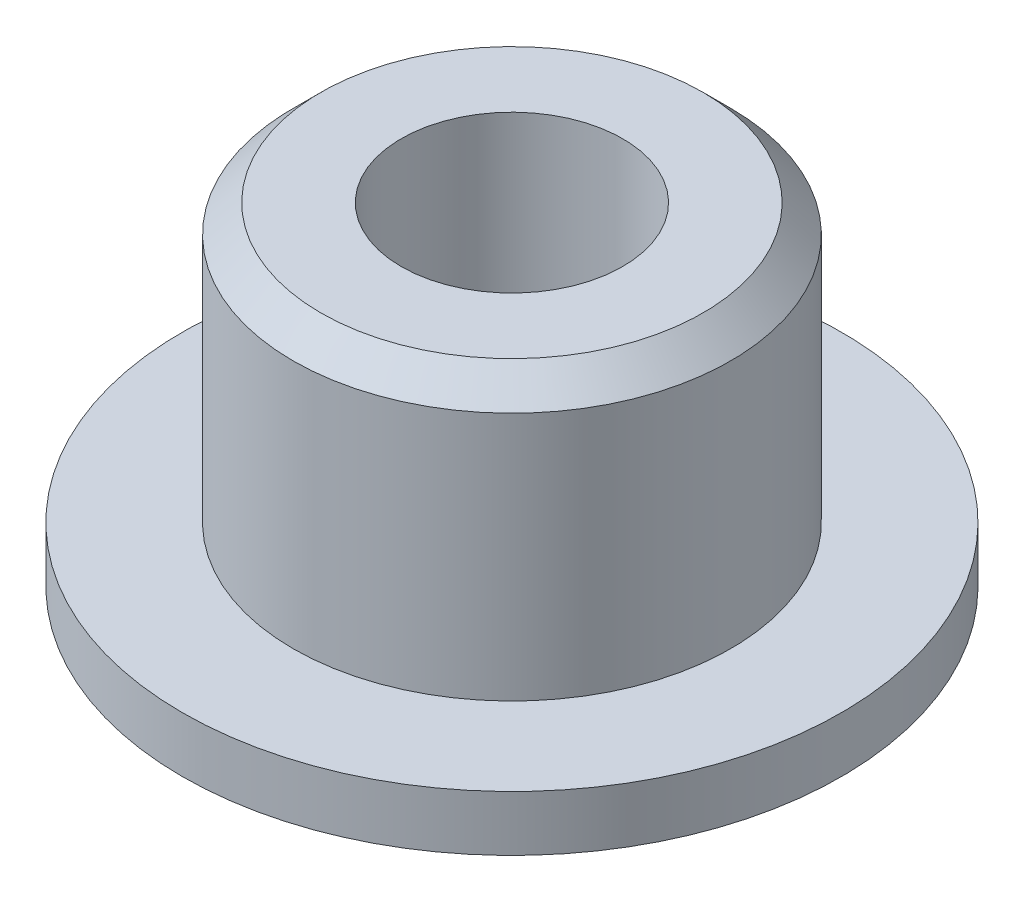
ISO-10303-21;
HEADER;
FILE_DESCRIPTION(('STEP AP214'),'2;1');
FILE_NAME('part.step','',(''),(''),'','','');
FILE_SCHEMA(('AUTOMOTIVE_DESIGN { 1 0 10303 214 1 1 1 1 }'));
ENDSEC;
DATA;
#1=APPLICATION_CONTEXT('core data for automotive mechanical design processes');
#2=APPLICATION_PROTOCOL_DEFINITION('international standard','automotive_design',2000,#1);
#3=PRODUCT_CONTEXT('',#1,'mechanical');
#4=PRODUCT('Part','Part','',(#3));
#5=PRODUCT_RELATED_PRODUCT_CATEGORY('part','',(#4));
#6=PRODUCT_DEFINITION_FORMATION('','',#4);
#7=PRODUCT_DEFINITION_CONTEXT('part definition',#1,'design');
#8=PRODUCT_DEFINITION('design','',#6,#7);
#9=PRODUCT_DEFINITION_SHAPE('','',#8);
#10=(LENGTH_UNIT() NAMED_UNIT(*) SI_UNIT(.MILLI.,.METRE.));
#11=(NAMED_UNIT(*) PLANE_ANGLE_UNIT() SI_UNIT($,.RADIAN.));
#12=(NAMED_UNIT(*) SI_UNIT($,.STERADIAN.) SOLID_ANGLE_UNIT());
#13=UNCERTAINTY_MEASURE_WITH_UNIT(LENGTH_MEASURE(1.E-05),#10,'distance_accuracy_value','');
#14=(GEOMETRIC_REPRESENTATION_CONTEXT(3) GLOBAL_UNCERTAINTY_ASSIGNED_CONTEXT((#13)) GLOBAL_UNIT_ASSIGNED_CONTEXT((#10,
#11,#12)) REPRESENTATION_CONTEXT('',''));
#15=CARTESIAN_POINT('',(0.,0.,0.));
#16=DIRECTION('',(0.,0.,1.));
#17=DIRECTION('',(1.,0.,0.));
#18=AXIS2_PLACEMENT_3D('',#15,#16,#17);
#19=CARTESIAN_POINT('',(3.95,0.,0.));
#20=DIRECTION('',(0.,-1.,0.));
#21=DIRECTION('',(0.,0.,-1.));
#22=AXIS2_PLACEMENT_3D('',#19,#20,#21);
#23=PLANE('',#22);
#24=CARTESIAN_POINT('',(0.,0.,0.));
#25=DIRECTION('',(0.,-1.,0.));
#26=DIRECTION('',(0.,0.,-1.));
#27=AXIS2_PLACEMENT_3D('',#24,#25,#26);
#28=CIRCLE('',#27,3.45000000000001);
#29=CARTESIAN_POINT('',(0.,0.,-3.45000000000001));
#30=VERTEX_POINT('',#29);
#31=EDGE_CURVE('E55',#30,#30,#28,.F.);
#32=ORIENTED_EDGE('',*,*,#31,.T.);
#33=EDGE_LOOP('',(#32));
#34=FACE_BOUND('',#33,.T.);
#35=CARTESIAN_POINT('',(0.,0.,0.));
#36=DIRECTION('',(0.,1.,0.));
#37=DIRECTION('',(0.,0.,1.));
#38=AXIS2_PLACEMENT_3D('',#35,#36,#37);
#39=CIRCLE('',#38,2.);
#40=CARTESIAN_POINT('',(0.,0.,2.));
#41=VERTEX_POINT('',#40);
#42=EDGE_CURVE('E61',#41,#41,#39,.T.);
#43=ORIENTED_EDGE('',*,*,#42,.F.);
#44=EDGE_LOOP('',(#43));
#45=FACE_BOUND('',#44,.T.);
#46=ADVANCED_FACE('F37',(#34,#45),#23,.F.);
#47=CARTESIAN_POINT('',(0.,16.5599354447662,0.));
#48=DIRECTION('',(0.,1.,0.));
#49=DIRECTION('',(0.,0.,1.));
#50=AXIS2_PLACEMENT_3D('',#47,#48,#49);
#51=CYLINDRICAL_SURFACE('',#50,2.);
#52=CARTESIAN_POINT('',(0.,-5.5,0.));
#53=DIRECTION('',(0.,1.,0.));
#54=DIRECTION('',(0.,0.,1.));
#55=AXIS2_PLACEMENT_3D('',#52,#53,#54);
#56=CIRCLE('',#55,2.);
#57=CARTESIAN_POINT('',(0.,-5.5,2.));
#58=VERTEX_POINT('',#57);
#59=EDGE_CURVE('E10',#58,#58,#56,.F.);
#60=ORIENTED_EDGE('',*,*,#59,.T.);
#61=EDGE_LOOP('',(#60));
#62=FACE_BOUND('',#61,.T.);
#63=ORIENTED_EDGE('',*,*,#42,.T.);
#64=EDGE_LOOP('',(#63));
#65=FACE_BOUND('',#64,.T.);
#66=ADVANCED_FACE('F94',(#62,#65),#51,.F.);
#67=CARTESIAN_POINT('',(5.95,-6.,0.));
#68=DIRECTION('',(0.,1.,0.));
#69=DIRECTION('',(0.,0.,1.));
#70=AXIS2_PLACEMENT_3D('',#67,#68,#69);
#71=PLANE('',#70);
#72=CARTESIAN_POINT('',(0.,-6.,0.));
#73=DIRECTION('',(0.,1.,0.));
#74=DIRECTION('',(0.,0.,1.));
#75=AXIS2_PLACEMENT_3D('',#72,#73,#74);
#76=CIRCLE('',#75,2.5);
#77=CARTESIAN_POINT('',(0.,-6.,2.5));
#78=VERTEX_POINT('',#77);
#79=EDGE_CURVE('E45',#78,#78,#76,.T.);
#80=ORIENTED_EDGE('',*,*,#79,.T.);
#81=EDGE_LOOP('',(#80));
#82=FACE_BOUND('',#81,.T.);
#83=CARTESIAN_POINT('',(0.,-6.,0.));
#84=DIRECTION('',(0.,1.,0.));
#85=DIRECTION('',(0.,0.,1.));
#86=AXIS2_PLACEMENT_3D('',#83,#84,#85);
#87=CIRCLE('',#86,5.95);
#88=CARTESIAN_POINT('',(0.,-6.,5.95));
#89=VERTEX_POINT('',#88);
#90=EDGE_CURVE('E65',#89,#89,#87,.T.);
#91=ORIENTED_EDGE('',*,*,#90,.F.);
#92=EDGE_LOOP('',(#91));
#93=FACE_BOUND('',#92,.T.);
#94=ADVANCED_FACE('F89',(#82,#93),#71,.F.);
#95=CARTESIAN_POINT('',(0.,16.5599354447662,0.));
#96=DIRECTION('',(0.,1.,0.));
#97=DIRECTION('',(0.,0.,1.));
#98=AXIS2_PLACEMENT_3D('',#95,#96,#97);
#99=CYLINDRICAL_SURFACE('',#98,5.95);
#100=CARTESIAN_POINT('',(0.,-5.,0.));
#101=DIRECTION('',(0.,1.,0.));
#102=DIRECTION('',(0.,0.,1.));
#103=AXIS2_PLACEMENT_3D('',#100,#101,#102);
#104=CIRCLE('',#103,5.95);
#105=CARTESIAN_POINT('',(0.,-5.,5.95));
#106=VERTEX_POINT('',#105);
#107=EDGE_CURVE('E69',#106,#106,#104,.T.);
#108=ORIENTED_EDGE('',*,*,#107,.F.);
#109=EDGE_LOOP('',(#108));
#110=FACE_BOUND('',#109,.T.);
#111=ORIENTED_EDGE('',*,*,#90,.T.);
#112=EDGE_LOOP('',(#111));
#113=FACE_BOUND('',#112,.T.);
#114=ADVANCED_FACE('F83',(#110,#113),#99,.T.);
#115=CARTESIAN_POINT('',(3.95,-5.,0.));
#116=DIRECTION('',(0.,-1.,0.));
#117=DIRECTION('',(0.,0.,-1.));
#118=AXIS2_PLACEMENT_3D('',#115,#116,#117);
#119=PLANE('',#118);
#120=CARTESIAN_POINT('',(0.,-5.,0.));
#121=DIRECTION('',(0.,1.,0.));
#122=DIRECTION('',(0.,0.,1.));
#123=AXIS2_PLACEMENT_3D('',#120,#121,#122);
#124=CIRCLE('',#123,3.95);
#125=CARTESIAN_POINT('',(0.,-5.,3.95));
#126=VERTEX_POINT('',#125);
#127=EDGE_CURVE('E73',#126,#126,#124,.T.);
#128=ORIENTED_EDGE('',*,*,#127,.F.);
#129=EDGE_LOOP('',(#128));
#130=FACE_BOUND('',#129,.T.);
#131=ORIENTED_EDGE('',*,*,#107,.T.);
#132=EDGE_LOOP('',(#131));
#133=FACE_BOUND('',#132,.T.);
#134=ADVANCED_FACE('F80',(#130,#133),#119,.F.);
#135=CARTESIAN_POINT('',(0.,16.5599354447662,0.));
#136=DIRECTION('',(0.,1.,0.));
#137=DIRECTION('',(0.,0.,1.));
#138=AXIS2_PLACEMENT_3D('',#135,#136,#137);
#139=CYLINDRICAL_SURFACE('',#138,3.95);
#140=CARTESIAN_POINT('',(0.,-0.499999999999997,0.));
#141=DIRECTION('',(0.,-1.,0.));
#142=DIRECTION('',(0.,0.,-1.));
#143=AXIS2_PLACEMENT_3D('',#140,#141,#142);
#144=CIRCLE('',#143,3.95);
#145=CARTESIAN_POINT('',(0.,-0.499999999999997,-3.95));
#146=VERTEX_POINT('',#145);
#147=EDGE_CURVE('E50',#146,#146,#144,.T.);
#148=ORIENTED_EDGE('',*,*,#147,.T.);
#149=EDGE_LOOP('',(#148));
#150=FACE_BOUND('',#149,.T.);
#151=ORIENTED_EDGE('',*,*,#127,.T.);
#152=EDGE_LOOP('',(#151));
#153=FACE_BOUND('',#152,.T.);
#154=ADVANCED_FACE('F78',(#150,#153),#139,.T.);
#155=CARTESIAN_POINT('',(0.,0.,0.));
#156=DIRECTION('',(0.,-1.,0.));
#157=DIRECTION('',(0.,0.,-1.));
#158=AXIS2_PLACEMENT_3D('',#155,#156,#157);
#159=CONICAL_SURFACE('',#158,3.45000000000001,0.785398163397447);
#160=ORIENTED_EDGE('',*,*,#147,.F.);
#161=EDGE_LOOP('',(#160));
#162=FACE_BOUND('',#161,.T.);
#163=ORIENTED_EDGE('',*,*,#31,.F.);
#164=EDGE_LOOP('',(#163));
#165=FACE_BOUND('',#164,.T.);
#166=ADVANCED_FACE('F106',(#162,#165),#159,.T.);
#167=CARTESIAN_POINT('',(0.,-6.,0.));
#168=DIRECTION('',(0.,-1.,0.));
#169=DIRECTION('',(0.,0.,-1.));
#170=AXIS2_PLACEMENT_3D('',#167,#168,#169);
#171=CONICAL_SURFACE('',#170,2.5,0.785398163397444);
#172=ORIENTED_EDGE('',*,*,#59,.F.);
#173=EDGE_LOOP('',(#172));
#174=FACE_BOUND('',#173,.T.);
#175=ORIENTED_EDGE('',*,*,#79,.F.);
#176=EDGE_LOOP('',(#175));
#177=FACE_BOUND('',#176,.T.);
#178=ADVANCED_FACE('F39',(#174,#177),#171,.F.);
#179=CLOSED_SHELL('',(#46,#66,#94,#114,#134,#154,#166,#178));
#180=MANIFOLD_SOLID_BREP('B2',#179);
#181=ADVANCED_BREP_SHAPE_REPRESENTATION('',(#18,#180),#14);
#182=SHAPE_DEFINITION_REPRESENTATION(#9,#181);
ENDSEC;
END-ISO-10303-21;
